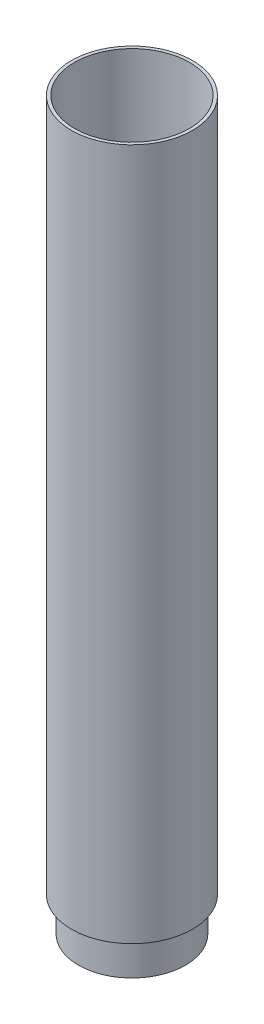
ISO-10303-21;
HEADER;
FILE_DESCRIPTION(('STEP AP214'),'2;1');
FILE_NAME('part.step','',(''),(''),'','','');
FILE_SCHEMA(('AUTOMOTIVE_DESIGN { 1 0 10303 214 1 1 1 1 }'));
ENDSEC;
DATA;
#1=APPLICATION_CONTEXT('core data for automotive mechanical design processes');
#2=APPLICATION_PROTOCOL_DEFINITION('international standard','automotive_design',2000,#1);
#3=PRODUCT_CONTEXT('',#1,'mechanical');
#4=PRODUCT('Part','Part','',(#3));
#5=PRODUCT_RELATED_PRODUCT_CATEGORY('part','',(#4));
#6=PRODUCT_DEFINITION_FORMATION('','',#4);
#7=PRODUCT_DEFINITION_CONTEXT('part definition',#1,'design');
#8=PRODUCT_DEFINITION('design','',#6,#7);
#9=PRODUCT_DEFINITION_SHAPE('','',#8);
#10=(LENGTH_UNIT() NAMED_UNIT(*) SI_UNIT(.MILLI.,.METRE.));
#11=(NAMED_UNIT(*) PLANE_ANGLE_UNIT() SI_UNIT($,.RADIAN.));
#12=(NAMED_UNIT(*) SI_UNIT($,.STERADIAN.) SOLID_ANGLE_UNIT());
#13=UNCERTAINTY_MEASURE_WITH_UNIT(LENGTH_MEASURE(1.E-05),#10,'distance_accuracy_value','');
#14=(GEOMETRIC_REPRESENTATION_CONTEXT(3) GLOBAL_UNCERTAINTY_ASSIGNED_CONTEXT((#13)) GLOBAL_UNIT_ASSIGNED_CONTEXT((#10,
#11,#12)) REPRESENTATION_CONTEXT('',''));
#15=CARTESIAN_POINT('',(0.,0.,0.));
#16=DIRECTION('',(0.,0.,1.));
#17=DIRECTION('',(1.,0.,0.));
#18=AXIS2_PLACEMENT_3D('',#15,#16,#17);
#19=CARTESIAN_POINT('',(0.,10.,0.));
#20=DIRECTION('',(0.,-1.,0.));
#21=DIRECTION('',(0.,0.,-1.));
#22=AXIS2_PLACEMENT_3D('',#19,#20,#21);
#23=CYLINDRICAL_SURFACE('',#22,14.);
#24=CARTESIAN_POINT('',(0.,0.,0.));
#25=DIRECTION('',(0.,1.,0.));
#26=DIRECTION('',(0.,0.,1.));
#27=AXIS2_PLACEMENT_3D('',#24,#25,#26);
#28=CIRCLE('',#27,14.);
#29=CARTESIAN_POINT('',(0.,0.,14.));
#30=VERTEX_POINT('',#29);
#31=EDGE_CURVE('E56',#30,#30,#28,.T.);
#32=ORIENTED_EDGE('',*,*,#31,.F.);
#33=EDGE_LOOP('',(#32));
#34=FACE_BOUND('',#33,.T.);
#35=CARTESIAN_POINT('',(0.,15.,0.));
#36=DIRECTION('',(0.,1.,0.));
#37=DIRECTION('',(0.,0.,1.));
#38=AXIS2_PLACEMENT_3D('',#35,#36,#37);
#39=CIRCLE('',#38,14.);
#40=CARTESIAN_POINT('',(0.,15.,14.));
#41=VERTEX_POINT('',#40);
#42=EDGE_CURVE('E45',#41,#41,#39,.T.);
#43=ORIENTED_EDGE('',*,*,#42,.T.);
#44=EDGE_LOOP('',(#43));
#45=FACE_BOUND('',#44,.T.);
#46=ADVANCED_FACE('F41',(#34,#45),#23,.F.);
#47=CARTESIAN_POINT('',(0.,0.,0.));
#48=DIRECTION('',(0.,1.,0.));
#49=DIRECTION('',(0.,0.,1.));
#50=AXIS2_PLACEMENT_3D('',#47,#48,#49);
#51=PLANE('',#50);
#52=CARTESIAN_POINT('',(0.,0.,0.));
#53=DIRECTION('',(0.,1.,0.));
#54=DIRECTION('',(0.,0.,1.));
#55=AXIS2_PLACEMENT_3D('',#52,#53,#54);
#56=CIRCLE('',#55,15.5);
#57=CARTESIAN_POINT('',(0.,0.,15.5));
#58=VERTEX_POINT('',#57);
#59=EDGE_CURVE('E50',#58,#58,#56,.T.);
#60=ORIENTED_EDGE('',*,*,#59,.F.);
#61=EDGE_LOOP('',(#60));
#62=FACE_BOUND('',#61,.T.);
#63=ORIENTED_EDGE('',*,*,#31,.T.);
#64=EDGE_LOOP('',(#63));
#65=FACE_BOUND('',#64,.T.);
#66=ADVANCED_FACE('F94',(#62,#65),#51,.F.);
#67=CARTESIAN_POINT('',(0.,10.,0.));
#68=DIRECTION('',(0.,-1.,0.));
#69=DIRECTION('',(0.,0.,-1.));
#70=AXIS2_PLACEMENT_3D('',#67,#68,#69);
#71=CYLINDRICAL_SURFACE('',#70,15.5);
#72=CARTESIAN_POINT('',(0.,10.,0.));
#73=DIRECTION('',(0.,1.,0.));
#74=DIRECTION('',(0.,0.,1.));
#75=AXIS2_PLACEMENT_3D('',#72,#73,#74);
#76=CIRCLE('',#75,15.5);
#77=CARTESIAN_POINT('',(0.,10.,15.5));
#78=VERTEX_POINT('',#77);
#79=EDGE_CURVE('E10',#78,#78,#76,.T.);
#80=ORIENTED_EDGE('',*,*,#79,.F.);
#81=EDGE_LOOP('',(#80));
#82=FACE_BOUND('',#81,.T.);
#83=ORIENTED_EDGE('',*,*,#59,.T.);
#84=EDGE_LOOP('',(#83));
#85=FACE_BOUND('',#84,.T.);
#86=ADVANCED_FACE('F43',(#82,#85),#71,.T.);
#87=CARTESIAN_POINT('',(0.,210.,0.));
#88=DIRECTION('',(0.,1.,0.));
#89=DIRECTION('',(0.,0.,1.));
#90=AXIS2_PLACEMENT_3D('',#87,#88,#89);
#91=PLANE('',#90);
#92=CARTESIAN_POINT('',(0.,210.,0.));
#93=DIRECTION('',(0.,1.,0.));
#94=DIRECTION('',(0.,0.,1.));
#95=AXIS2_PLACEMENT_3D('',#92,#93,#94);
#96=CIRCLE('',#95,16.6);
#97=CARTESIAN_POINT('',(0.,210.,16.6));
#98=VERTEX_POINT('',#97);
#99=EDGE_CURVE('E69',#98,#98,#96,.T.);
#100=ORIENTED_EDGE('',*,*,#99,.F.);
#101=EDGE_LOOP('',(#100));
#102=FACE_BOUND('',#101,.T.);
#103=CARTESIAN_POINT('',(0.,210.,0.));
#104=DIRECTION('',(0.,1.,0.));
#105=DIRECTION('',(0.,0.,1.));
#106=AXIS2_PLACEMENT_3D('',#103,#104,#105);
#107=CIRCLE('',#106,17.5);
#108=CARTESIAN_POINT('',(0.,210.,17.5));
#109=VERTEX_POINT('',#108);
#110=EDGE_CURVE('E61',#109,#109,#107,.T.);
#111=ORIENTED_EDGE('',*,*,#110,.T.);
#112=EDGE_LOOP('',(#111));
#113=FACE_BOUND('',#112,.T.);
#114=ADVANCED_FACE('F109',(#102,#113),#91,.T.);
#115=CARTESIAN_POINT('',(0.,10.,0.));
#116=DIRECTION('',(0.,1.,0.));
#117=DIRECTION('',(0.,0.,1.));
#118=AXIS2_PLACEMENT_3D('',#115,#116,#117);
#119=PLANE('',#118);
#120=ORIENTED_EDGE('',*,*,#79,.T.);
#121=EDGE_LOOP('',(#120));
#122=FACE_BOUND('',#121,.T.);
#123=CARTESIAN_POINT('',(0.,10.,0.));
#124=DIRECTION('',(0.,1.,0.));
#125=DIRECTION('',(0.,0.,1.));
#126=AXIS2_PLACEMENT_3D('',#123,#124,#125);
#127=CIRCLE('',#126,17.5);
#128=CARTESIAN_POINT('',(0.,10.,17.5));
#129=VERTEX_POINT('',#128);
#130=EDGE_CURVE('E62',#129,#129,#127,.T.);
#131=ORIENTED_EDGE('',*,*,#130,.F.);
#132=EDGE_LOOP('',(#131));
#133=FACE_BOUND('',#132,.T.);
#134=ADVANCED_FACE('F105',(#122,#133),#119,.F.);
#135=CARTESIAN_POINT('',(0.,210.,0.));
#136=DIRECTION('',(0.,-1.,0.));
#137=DIRECTION('',(0.,0.,-1.));
#138=AXIS2_PLACEMENT_3D('',#135,#136,#137);
#139=CYLINDRICAL_SURFACE('',#138,17.5);
#140=ORIENTED_EDGE('',*,*,#110,.F.);
#141=EDGE_LOOP('',(#140));
#142=FACE_BOUND('',#141,.T.);
#143=ORIENTED_EDGE('',*,*,#130,.T.);
#144=EDGE_LOOP('',(#143));
#145=FACE_BOUND('',#144,.T.);
#146=ADVANCED_FACE('F90',(#142,#145),#139,.T.);
#147=CARTESIAN_POINT('',(0.,15.,0.));
#148=DIRECTION('',(0.,1.,0.));
#149=DIRECTION('',(0.,0.,1.));
#150=AXIS2_PLACEMENT_3D('',#147,#148,#149);
#151=CYLINDRICAL_SURFACE('',#150,16.6);
#152=CARTESIAN_POINT('',(0.,15.,0.));
#153=DIRECTION('',(0.,1.,0.));
#154=DIRECTION('',(0.,0.,1.));
#155=AXIS2_PLACEMENT_3D('',#152,#153,#154);
#156=CIRCLE('',#155,16.6);
#157=CARTESIAN_POINT('',(0.,15.,16.6));
#158=VERTEX_POINT('',#157);
#159=EDGE_CURVE('E73',#158,#158,#156,.T.);
#160=ORIENTED_EDGE('',*,*,#159,.F.);
#161=EDGE_LOOP('',(#160));
#162=FACE_BOUND('',#161,.T.);
#163=ORIENTED_EDGE('',*,*,#99,.T.);
#164=EDGE_LOOP('',(#163));
#165=FACE_BOUND('',#164,.T.);
#166=ADVANCED_FACE('F85',(#162,#165),#151,.F.);
#167=CARTESIAN_POINT('',(0.,15.,0.));
#168=DIRECTION('',(0.,1.,0.));
#169=DIRECTION('',(0.,0.,1.));
#170=AXIS2_PLACEMENT_3D('',#167,#168,#169);
#171=PLANE('',#170);
#172=ORIENTED_EDGE('',*,*,#42,.F.);
#173=EDGE_LOOP('',(#172));
#174=FACE_BOUND('',#173,.T.);
#175=ORIENTED_EDGE('',*,*,#159,.T.);
#176=EDGE_LOOP('',(#175));
#177=FACE_BOUND('',#176,.T.);
#178=ADVANCED_FACE('F83',(#174,#177),#171,.T.);
#179=CLOSED_SHELL('',(#46,#66,#86,#114,#134,#146,#166,#178));
#180=MANIFOLD_SOLID_BREP('B2',#179);
#181=ADVANCED_BREP_SHAPE_REPRESENTATION('',(#18,#180),#14);
#182=SHAPE_DEFINITION_REPRESENTATION(#9,#181);
ENDSEC;
END-ISO-10303-21;
